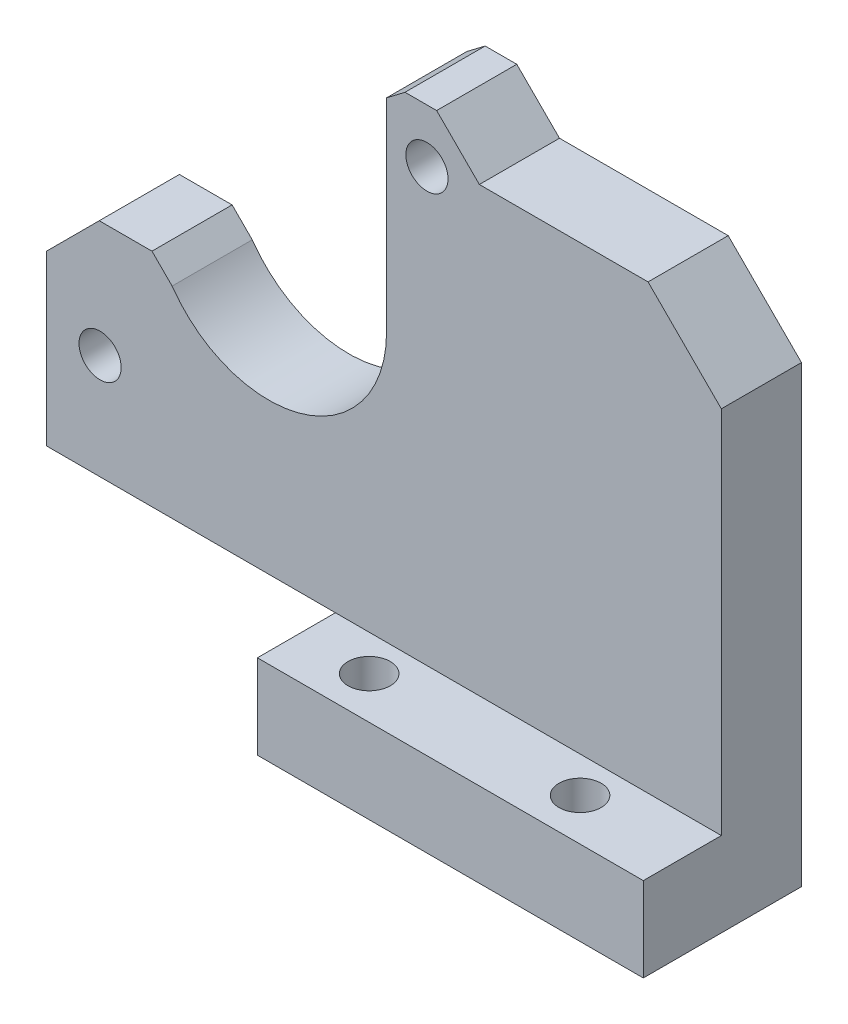
ISO-10303-21;
HEADER;
FILE_DESCRIPTION(('STEP AP214'),'2;1');
FILE_NAME('part.step','',(''),(''),'','','');
FILE_SCHEMA(('AUTOMOTIVE_DESIGN { 1 0 10303 214 1 1 1 1 }'));
ENDSEC;
DATA;
#1=APPLICATION_CONTEXT('core data for automotive mechanical design processes');
#2=APPLICATION_PROTOCOL_DEFINITION('international standard','automotive_design',2000,#1);
#3=PRODUCT_CONTEXT('',#1,'mechanical');
#4=PRODUCT('Part','Part','',(#3));
#5=PRODUCT_RELATED_PRODUCT_CATEGORY('part','',(#4));
#6=PRODUCT_DEFINITION_FORMATION('','',#4);
#7=PRODUCT_DEFINITION_CONTEXT('part definition',#1,'design');
#8=PRODUCT_DEFINITION('design','',#6,#7);
#9=PRODUCT_DEFINITION_SHAPE('','',#8);
#10=(LENGTH_UNIT() NAMED_UNIT(*) SI_UNIT(.MILLI.,.METRE.));
#11=(NAMED_UNIT(*) PLANE_ANGLE_UNIT() SI_UNIT($,.RADIAN.));
#12=(NAMED_UNIT(*) SI_UNIT($,.STERADIAN.) SOLID_ANGLE_UNIT());
#13=UNCERTAINTY_MEASURE_WITH_UNIT(LENGTH_MEASURE(1.E-05),#10,'distance_accuracy_value','');
#14=(GEOMETRIC_REPRESENTATION_CONTEXT(3) GLOBAL_UNCERTAINTY_ASSIGNED_CONTEXT((#13)) GLOBAL_UNIT_ASSIGNED_CONTEXT((#10,
#11,#12)) REPRESENTATION_CONTEXT('',''));
#15=CARTESIAN_POINT('',(0.,0.,0.));
#16=DIRECTION('',(0.,0.,1.));
#17=DIRECTION('',(1.,0.,0.));
#18=AXIS2_PLACEMENT_3D('',#15,#16,#17);
#19=CARTESIAN_POINT('',(21.08,25.4680874876408,7.59999999999993));
#20=DIRECTION('',(0.,0.,-1.));
#21=DIRECTION('',(-1.,0.,0.));
#22=AXIS2_PLACEMENT_3D('',#19,#20,#21);
#23=PLANE('',#22);
#24=CARTESIAN_POINT('',(5.08,9.96808748764078,7.6));
#25=DIRECTION('',(0.,0.,1.));
#26=DIRECTION('',(1.,0.,0.));
#27=AXIS2_PLACEMENT_3D('',#24,#25,#26);
#28=CIRCLE('',#27,2.);
#29=CARTESIAN_POINT('',(7.07999999999999,9.96808748764078,7.6));
#30=VERTEX_POINT('',#29);
#31=EDGE_CURVE('E426',#30,#30,#28,.T.);
#32=ORIENTED_EDGE('',*,*,#31,.F.);
#33=EDGE_LOOP('',(#32));
#34=FACE_BOUND('',#33,.T.);
#35=CARTESIAN_POINT('',(36.08,40.9680874876408,7.59999999999991));
#36=DIRECTION('',(0.,0.,1.));
#37=DIRECTION('',(1.,0.,0.));
#38=AXIS2_PLACEMENT_3D('',#35,#36,#37);
#39=CIRCLE('',#38,2.);
#40=CARTESIAN_POINT('',(38.08,40.9680874876408,7.59999999999992));
#41=VERTEX_POINT('',#40);
#42=EDGE_CURVE('E418',#41,#41,#39,.T.);
#43=ORIENTED_EDGE('',*,*,#42,.F.);
#44=EDGE_LOOP('',(#43));
#45=FACE_BOUND('',#44,.T.);
#46=DIRECTION('',(-1.,0.,0.));
#47=VECTOR('',#46,1.);
#48=CARTESIAN_POINT('',(64.,0.,7.59999999999988));
#49=LINE('',#48,#47);
#50=CARTESIAN_POINT('',(64.,0.,7.59999999999988));
#51=VERTEX_POINT('',#50);
#52=CARTESIAN_POINT('',(27.4,0.,7.59999999999997));
#53=VERTEX_POINT('',#52);
#54=EDGE_CURVE('E56',#51,#53,#49,.T.);
#55=ORIENTED_EDGE('',*,*,#54,.F.);
#56=DIRECTION('',(0.,1.,0.));
#57=VECTOR('',#56,1.);
#58=CARTESIAN_POINT('',(64.,-8.00000000000001,7.59999999999988));
#59=LINE('',#58,#57);
#60=CARTESIAN_POINT('',(64.,35.05,7.59999999999988));
#61=VERTEX_POINT('',#60);
#62=EDGE_CURVE('E123',#51,#61,#59,.T.);
#63=ORIENTED_EDGE('',*,*,#62,.T.);
#64=DIRECTION('',(-0.707106781186547,0.707106781186547,0.));
#65=VECTOR('',#64,1.);
#66=CARTESIAN_POINT('',(57.05,42.,7.59999999999984));
#67=LINE('',#66,#65);
#68=CARTESIAN_POINT('',(57.05,42.,7.59999999999984));
#69=VERTEX_POINT('',#68);
#70=EDGE_CURVE('E281',#61,#69,#67,.T.);
#71=ORIENTED_EDGE('',*,*,#70,.T.);
#72=DIRECTION('',(-1.,0.,0.));
#73=VECTOR('',#72,1.);
#74=CARTESIAN_POINT('',(57.05,42.,7.59999999999984));
#75=LINE('',#74,#73);
#76=CARTESIAN_POINT('',(41.05,42.,7.59999999999991));
#77=VERTEX_POINT('',#76);
#78=EDGE_CURVE('E301',#69,#77,#75,.T.);
#79=ORIENTED_EDGE('',*,*,#78,.T.);
#80=DIRECTION('',(-0.707106781186548,0.707106781186547,0.));
#81=VECTOR('',#80,1.);
#82=CARTESIAN_POINT('',(41.05,42.,7.59999999999991));
#83=LINE('',#82,#81);
#84=CARTESIAN_POINT('',(37.,46.05,7.59999999999991));
#85=VERTEX_POINT('',#84);
#86=EDGE_CURVE('E297',#77,#85,#83,.T.);
#87=ORIENTED_EDGE('',*,*,#86,.T.);
#88=DIRECTION('',(-1.,0.,0.));
#89=VECTOR('',#88,1.);
#90=CARTESIAN_POINT('',(37.,46.05,7.59999999999991));
#91=LINE('',#90,#89);
#92=CARTESIAN_POINT('',(34.,46.05,7.59999999999991));
#93=VERTEX_POINT('',#92);
#94=EDGE_CURVE('E300',#85,#93,#91,.T.);
#95=ORIENTED_EDGE('',*,*,#94,.T.);
#96=DIRECTION('',(-0.79574305950185,-0.605634364327715,0.));
#97=VECTOR('',#96,1.);
#98=CARTESIAN_POINT('',(34.,46.05,7.59999999999991));
#99=LINE('',#98,#97);
#100=CARTESIAN_POINT('',(32.25,44.7180874876408,7.5999999999999));
#101=VERTEX_POINT('',#100);
#102=EDGE_CURVE('E306',#93,#101,#99,.T.);
#103=ORIENTED_EDGE('',*,*,#102,.T.);
#104=DIRECTION('',(0.,-1.,0.));
#105=VECTOR('',#104,1.);
#106=CARTESIAN_POINT('',(32.25,44.7180874876408,7.5999999999999));
#107=LINE('',#106,#105);
#108=CARTESIAN_POINT('',(32.25,25.4680874876408,7.5999999999999));
#109=VERTEX_POINT('',#108);
#110=EDGE_CURVE('E313',#101,#109,#107,.T.);
#111=ORIENTED_EDGE('',*,*,#110,.T.);
#112=CARTESIAN_POINT('',(21.08,25.4680874876408,7.59999999999993));
#113=DIRECTION('',(0.,0.,-1.));
#114=DIRECTION('',(-1.,0.,0.));
#115=AXIS2_PLACEMENT_3D('',#112,#113,#114);
#116=CIRCLE('',#115,11.17);
#117=CARTESIAN_POINT('',(11.91,19.09,7.59999999999997));
#118=VERTEX_POINT('',#117);
#119=EDGE_CURVE('E316',#109,#118,#116,.T.);
#120=ORIENTED_EDGE('',*,*,#119,.T.);
#121=DIRECTION('',(-0.707106781186548,0.707106781186547,0.));
#122=VECTOR('',#121,1.);
#123=CARTESIAN_POINT('',(11.91,19.09,7.59999999999997));
#124=LINE('',#123,#122);
#125=CARTESIAN_POINT('',(10.,21.,7.59999999999998));
#126=VERTEX_POINT('',#125);
#127=EDGE_CURVE('E158',#118,#126,#124,.T.);
#128=ORIENTED_EDGE('',*,*,#127,.T.);
#129=DIRECTION('',(-1.,0.,0.));
#130=VECTOR('',#129,1.);
#131=CARTESIAN_POINT('',(10.,21.,7.59999999999998));
#132=LINE('',#131,#130);
#133=CARTESIAN_POINT('',(5.,21.,7.6));
#134=VERTEX_POINT('',#133);
#135=EDGE_CURVE('E152',#126,#134,#132,.T.);
#136=ORIENTED_EDGE('',*,*,#135,.T.);
#137=DIRECTION('',(-0.707106781186547,-0.707106781186548,0.));
#138=VECTOR('',#137,1.);
#139=CARTESIAN_POINT('',(5.,21.,7.6));
#140=LINE('',#139,#138);
#141=CARTESIAN_POINT('',(0.,16.,7.6));
#142=VERTEX_POINT('',#141);
#143=EDGE_CURVE('E155',#134,#142,#140,.T.);
#144=ORIENTED_EDGE('',*,*,#143,.T.);
#145=DIRECTION('',(0.,-1.,0.));
#146=VECTOR('',#145,1.);
#147=CARTESIAN_POINT('',(0.,0.,7.6));
#148=LINE('',#147,#146);
#149=CARTESIAN_POINT('',(0.,0.,7.6));
#150=VERTEX_POINT('',#149);
#151=EDGE_CURVE('E63',#142,#150,#148,.T.);
#152=ORIENTED_EDGE('',*,*,#151,.T.);
#153=DIRECTION('',(1.,0.,0.));
#154=VECTOR('',#153,1.);
#155=CARTESIAN_POINT('',(0.,0.,7.6));
#156=LINE('',#155,#154);
#157=EDGE_CURVE('E181',#150,#53,#156,.T.);
#158=ORIENTED_EDGE('',*,*,#157,.T.);
#159=EDGE_LOOP('',(#55,#63,#71,#79,#87,#95,#103,#111,#120,#128,#136,#144,#152,#158));
#160=FACE_BOUND('',#159,.T.);
#161=ADVANCED_FACE('F40',(#34,#45,#160),#23,.F.);
#162=CARTESIAN_POINT('',(27.4,-8.00000000000001,7.59999999999997));
#163=DIRECTION('',(0.,1.,0.));
#164=DIRECTION('',(0.,0.,1.));
#165=AXIS2_PLACEMENT_3D('',#162,#163,#164);
#166=PLANE('',#165);
#167=CARTESIAN_POINT('',(54.,-8.00000000000001,10.9999999999998));
#168=DIRECTION('',(0.,1.,0.));
#169=DIRECTION('',(0.,0.,1.));
#170=AXIS2_PLACEMENT_3D('',#167,#168,#169);
#171=CIRCLE('',#170,2.);
#172=CARTESIAN_POINT('',(54.,-8.00000000000001,12.9999999999998));
#173=VERTEX_POINT('',#172);
#174=EDGE_CURVE('E356',#173,#173,#171,.T.);
#175=ORIENTED_EDGE('',*,*,#174,.T.);
#176=EDGE_LOOP('',(#175));
#177=FACE_BOUND('',#176,.T.);
#178=CARTESIAN_POINT('',(34.,-8.00000000000001,10.9999999999999));
#179=DIRECTION('',(0.,1.,0.));
#180=DIRECTION('',(0.,0.,1.));
#181=AXIS2_PLACEMENT_3D('',#178,#179,#180);
#182=CIRCLE('',#181,2.);
#183=CARTESIAN_POINT('',(34.,-8.00000000000001,12.9999999999999));
#184=VERTEX_POINT('',#183);
#185=EDGE_CURVE('E406',#184,#184,#182,.T.);
#186=ORIENTED_EDGE('',*,*,#185,.T.);
#187=EDGE_LOOP('',(#186));
#188=FACE_BOUND('',#187,.T.);
#189=DIRECTION('',(1.,0.,0.));
#190=VECTOR('',#189,1.);
#191=CARTESIAN_POINT('',(27.4,-8.00000000000001,0.));
#192=LINE('',#191,#190);
#193=CARTESIAN_POINT('',(27.4,-8.00000000000001,0.));
#194=VERTEX_POINT('',#193);
#195=CARTESIAN_POINT('',(64.,-8.00000000000001,-1.11022302462516E-13));
#196=VERTEX_POINT('',#195);
#197=EDGE_CURVE('E188',#194,#196,#192,.T.);
#198=ORIENTED_EDGE('',*,*,#197,.T.);
#199=DIRECTION('',(0.,0.,-1.));
#200=VECTOR('',#199,1.);
#201=CARTESIAN_POINT('',(64.,-8.00000000000001,7.59999999999988));
#202=LINE('',#201,#200);
#203=CARTESIAN_POINT('',(64.,-8.00000000000001,14.9999999999998));
#204=VERTEX_POINT('',#203);
#205=EDGE_CURVE('E11',#204,#196,#202,.T.);
#206=ORIENTED_EDGE('',*,*,#205,.F.);
#207=DIRECTION('',(1.,0.,0.));
#208=VECTOR('',#207,1.);
#209=CARTESIAN_POINT('',(64.,-8.00000000000001,14.9999999999998));
#210=LINE('',#209,#208);
#211=CARTESIAN_POINT('',(27.4,-8.00000000000001,14.9999999999998));
#212=VERTEX_POINT('',#211);
#213=EDGE_CURVE('E362',#212,#204,#210,.T.);
#214=ORIENTED_EDGE('',*,*,#213,.F.);
#215=DIRECTION('',(0.,0.,-1.));
#216=VECTOR('',#215,1.);
#217=CARTESIAN_POINT('',(27.4,-8.00000000000001,7.59999999999997));
#218=LINE('',#217,#216);
#219=EDGE_CURVE('E187',#212,#194,#218,.T.);
#220=ORIENTED_EDGE('',*,*,#219,.T.);
#221=EDGE_LOOP('',(#198,#206,#214,#220));
#222=FACE_BOUND('',#221,.T.);
#223=ADVANCED_FACE('F42',(#177,#188,#222),#166,.F.);
#224=CARTESIAN_POINT('',(64.,-8.00000000000001,7.59999999999988));
#225=DIRECTION('',(-1.,0.,0.));
#226=DIRECTION('',(0.,0.,1.));
#227=AXIS2_PLACEMENT_3D('',#224,#225,#226);
#228=PLANE('',#227);
#229=DIRECTION('',(0.,1.,0.));
#230=VECTOR('',#229,1.);
#231=CARTESIAN_POINT('',(64.,-8.00000000000001,-1.11022302462516E-13));
#232=LINE('',#231,#230);
#233=CARTESIAN_POINT('',(64.,35.05,-1.11022302462516E-13));
#234=VERTEX_POINT('',#233);
#235=EDGE_CURVE('E192',#196,#234,#232,.T.);
#236=ORIENTED_EDGE('',*,*,#235,.T.);
#237=DIRECTION('',(0.,0.,-1.));
#238=VECTOR('',#237,1.);
#239=CARTESIAN_POINT('',(64.,35.05,7.59999999999988));
#240=LINE('',#239,#238);
#241=EDGE_CURVE('E49',#61,#234,#240,.T.);
#242=ORIENTED_EDGE('',*,*,#241,.F.);
#243=ORIENTED_EDGE('',*,*,#62,.F.);
#244=DIRECTION('',(0.,0.,-1.));
#245=VECTOR('',#244,1.);
#246=CARTESIAN_POINT('',(64.,0.,14.9999999999998));
#247=LINE('',#246,#245);
#248=CARTESIAN_POINT('',(64.,0.,14.9999999999998));
#249=VERTEX_POINT('',#248);
#250=EDGE_CURVE('E193',#249,#51,#247,.T.);
#251=ORIENTED_EDGE('',*,*,#250,.F.);
#252=DIRECTION('',(0.,1.,0.));
#253=VECTOR('',#252,1.);
#254=CARTESIAN_POINT('',(64.,0.,14.9999999999998));
#255=LINE('',#254,#253);
#256=EDGE_CURVE('E355',#204,#249,#255,.T.);
#257=ORIENTED_EDGE('',*,*,#256,.F.);
#258=ORIENTED_EDGE('',*,*,#205,.T.);
#259=EDGE_LOOP('',(#236,#242,#243,#251,#257,#258));
#260=FACE_BOUND('',#259,.T.);
#261=ADVANCED_FACE('F504',(#260),#228,.F.);
#262=CARTESIAN_POINT('',(57.05,42.,7.59999999999984));
#263=DIRECTION('',(-0.707106781186548,-0.707106781186548,0.));
#264=DIRECTION('',(0.707106781186548,-0.707106781186548,0.));
#265=AXIS2_PLACEMENT_3D('',#262,#263,#264);
#266=PLANE('',#265);
#267=DIRECTION('',(-0.707106781186547,0.707106781186547,0.));
#268=VECTOR('',#267,1.);
#269=CARTESIAN_POINT('',(57.05,42.,-1.66533453693773E-13));
#270=LINE('',#269,#268);
#271=CARTESIAN_POINT('',(57.05,42.,-1.66533453693773E-13));
#272=VERTEX_POINT('',#271);
#273=EDGE_CURVE('E196',#234,#272,#270,.T.);
#274=ORIENTED_EDGE('',*,*,#273,.T.);
#275=DIRECTION('',(0.,0.,-1.));
#276=VECTOR('',#275,1.);
#277=CARTESIAN_POINT('',(57.05,42.,7.59999999999984));
#278=LINE('',#277,#276);
#279=EDGE_CURVE('E270',#69,#272,#278,.T.);
#280=ORIENTED_EDGE('',*,*,#279,.F.);
#281=ORIENTED_EDGE('',*,*,#70,.F.);
#282=ORIENTED_EDGE('',*,*,#241,.T.);
#283=EDGE_LOOP('',(#274,#280,#281,#282));
#284=FACE_BOUND('',#283,.T.);
#285=ADVANCED_FACE('F279',(#284),#266,.F.);
#286=CARTESIAN_POINT('',(57.05,42.,7.59999999999984));
#287=DIRECTION('',(0.,-1.,0.));
#288=DIRECTION('',(0.,0.,-1.));
#289=AXIS2_PLACEMENT_3D('',#286,#287,#288);
#290=PLANE('',#289);
#291=DIRECTION('',(-1.,0.,0.));
#292=VECTOR('',#291,1.);
#293=CARTESIAN_POINT('',(57.05,42.,-1.66533453693773E-13));
#294=LINE('',#293,#292);
#295=CARTESIAN_POINT('',(41.05,42.,0.));
#296=VERTEX_POINT('',#295);
#297=EDGE_CURVE('E199',#272,#296,#294,.T.);
#298=ORIENTED_EDGE('',*,*,#297,.T.);
#299=DIRECTION('',(0.,0.,-1.));
#300=VECTOR('',#299,1.);
#301=CARTESIAN_POINT('',(41.05,42.,7.59999999999991));
#302=LINE('',#301,#300);
#303=EDGE_CURVE('E266',#77,#296,#302,.T.);
#304=ORIENTED_EDGE('',*,*,#303,.F.);
#305=ORIENTED_EDGE('',*,*,#78,.F.);
#306=ORIENTED_EDGE('',*,*,#279,.T.);
#307=EDGE_LOOP('',(#298,#304,#305,#306));
#308=FACE_BOUND('',#307,.T.);
#309=ADVANCED_FACE('F291',(#308),#290,.F.);
#310=CARTESIAN_POINT('',(41.05,42.,7.59999999999991));
#311=DIRECTION('',(-0.707106781186547,-0.707106781186548,0.));
#312=DIRECTION('',(0.707106781186548,-0.707106781186547,0.));
#313=AXIS2_PLACEMENT_3D('',#310,#311,#312);
#314=PLANE('',#313);
#315=DIRECTION('',(-0.707106781186548,0.707106781186547,0.));
#316=VECTOR('',#315,1.);
#317=CARTESIAN_POINT('',(41.05,42.,0.));
#318=LINE('',#317,#316);
#319=CARTESIAN_POINT('',(37.,46.05,0.));
#320=VERTEX_POINT('',#319);
#321=EDGE_CURVE('E202',#296,#320,#318,.T.);
#322=ORIENTED_EDGE('',*,*,#321,.T.);
#323=DIRECTION('',(0.,0.,-1.));
#324=VECTOR('',#323,1.);
#325=CARTESIAN_POINT('',(37.,46.05,7.59999999999991));
#326=LINE('',#325,#324);
#327=EDGE_CURVE('E262',#85,#320,#326,.T.);
#328=ORIENTED_EDGE('',*,*,#327,.F.);
#329=ORIENTED_EDGE('',*,*,#86,.F.);
#330=ORIENTED_EDGE('',*,*,#303,.T.);
#331=EDGE_LOOP('',(#322,#328,#329,#330));
#332=FACE_BOUND('',#331,.T.);
#333=ADVANCED_FACE('F295',(#332),#314,.F.);
#334=CARTESIAN_POINT('',(37.,46.05,7.59999999999991));
#335=DIRECTION('',(0.,-1.,0.));
#336=DIRECTION('',(0.,0.,-1.));
#337=AXIS2_PLACEMENT_3D('',#334,#335,#336);
#338=PLANE('',#337);
#339=DIRECTION('',(-1.,0.,0.));
#340=VECTOR('',#339,1.);
#341=CARTESIAN_POINT('',(37.,46.05,0.));
#342=LINE('',#341,#340);
#343=CARTESIAN_POINT('',(34.,46.05,0.));
#344=VERTEX_POINT('',#343);
#345=EDGE_CURVE('E205',#320,#344,#342,.T.);
#346=ORIENTED_EDGE('',*,*,#345,.T.);
#347=DIRECTION('',(0.,0.,-1.));
#348=VECTOR('',#347,1.);
#349=CARTESIAN_POINT('',(34.,46.05,7.59999999999991));
#350=LINE('',#349,#348);
#351=EDGE_CURVE('E258',#93,#344,#350,.T.);
#352=ORIENTED_EDGE('',*,*,#351,.F.);
#353=ORIENTED_EDGE('',*,*,#94,.F.);
#354=ORIENTED_EDGE('',*,*,#327,.T.);
#355=EDGE_LOOP('',(#346,#352,#353,#354));
#356=FACE_BOUND('',#355,.T.);
#357=ADVANCED_FACE('F494',(#356),#338,.F.);
#358=CARTESIAN_POINT('',(34.,46.05,7.59999999999991));
#359=DIRECTION('',(0.605634364327715,-0.79574305950185,0.));
#360=DIRECTION('',(0.79574305950185,0.605634364327715,0.));
#361=AXIS2_PLACEMENT_3D('',#358,#359,#360);
#362=PLANE('',#361);
#363=DIRECTION('',(-0.79574305950185,-0.605634364327715,0.));
#364=VECTOR('',#363,1.);
#365=CARTESIAN_POINT('',(34.,46.05,0.));
#366=LINE('',#365,#364);
#367=CARTESIAN_POINT('',(32.25,44.7180874876408,-1.11022302462516E-13));
#368=VERTEX_POINT('',#367);
#369=EDGE_CURVE('E208',#344,#368,#366,.T.);
#370=ORIENTED_EDGE('',*,*,#369,.T.);
#371=DIRECTION('',(0.,0.,-1.));
#372=VECTOR('',#371,1.);
#373=CARTESIAN_POINT('',(32.25,44.7180874876408,7.5999999999999));
#374=LINE('',#373,#372);
#375=EDGE_CURVE('E254',#101,#368,#374,.T.);
#376=ORIENTED_EDGE('',*,*,#375,.F.);
#377=ORIENTED_EDGE('',*,*,#102,.F.);
#378=ORIENTED_EDGE('',*,*,#351,.T.);
#379=EDGE_LOOP('',(#370,#376,#377,#378));
#380=FACE_BOUND('',#379,.T.);
#381=ADVANCED_FACE('F490',(#380),#362,.F.);
#382=CARTESIAN_POINT('',(32.25,44.7180874876408,7.5999999999999));
#383=DIRECTION('',(1.,0.,0.));
#384=DIRECTION('',(0.,1.,0.));
#385=AXIS2_PLACEMENT_3D('',#382,#383,#384);
#386=PLANE('',#385);
#387=DIRECTION('',(0.,-1.,0.));
#388=VECTOR('',#387,1.);
#389=CARTESIAN_POINT('',(32.25,44.7180874876408,-1.11022302462516E-13));
#390=LINE('',#389,#388);
#391=CARTESIAN_POINT('',(32.25,25.4680874876408,-1.11022302462516E-13));
#392=VERTEX_POINT('',#391);
#393=EDGE_CURVE('E211',#368,#392,#390,.T.);
#394=ORIENTED_EDGE('',*,*,#393,.T.);
#395=DIRECTION('',(0.,0.,-1.));
#396=VECTOR('',#395,1.);
#397=CARTESIAN_POINT('',(32.25,25.4680874876408,7.5999999999999));
#398=LINE('',#397,#396);
#399=EDGE_CURVE('E250',#109,#392,#398,.T.);
#400=ORIENTED_EDGE('',*,*,#399,.F.);
#401=ORIENTED_EDGE('',*,*,#110,.F.);
#402=ORIENTED_EDGE('',*,*,#375,.T.);
#403=EDGE_LOOP('',(#394,#400,#401,#402));
#404=FACE_BOUND('',#403,.T.);
#405=ADVANCED_FACE('F487',(#404),#386,.F.);
#406=CARTESIAN_POINT('',(21.08,25.4680874876408,7.59999999999993));
#407=DIRECTION('',(0.,0.,-1.));
#408=DIRECTION('',(-1.,0.,0.));
#409=AXIS2_PLACEMENT_3D('',#406,#407,#408);
#410=CYLINDRICAL_SURFACE('',#409,11.17);
#411=CARTESIAN_POINT('',(21.08,25.4680874876408,0.));
#412=DIRECTION('',(0.,0.,-1.));
#413=DIRECTION('',(-1.,0.,0.));
#414=AXIS2_PLACEMENT_3D('',#411,#412,#413);
#415=CIRCLE('',#414,11.17);
#416=CARTESIAN_POINT('',(11.91,19.09,0.));
#417=VERTEX_POINT('',#416);
#418=EDGE_CURVE('E214',#392,#417,#415,.T.);
#419=ORIENTED_EDGE('',*,*,#418,.T.);
#420=DIRECTION('',(0.,0.,-1.));
#421=VECTOR('',#420,1.);
#422=CARTESIAN_POINT('',(11.91,19.09,7.59999999999997));
#423=LINE('',#422,#421);
#424=EDGE_CURVE('E246',#118,#417,#423,.T.);
#425=ORIENTED_EDGE('',*,*,#424,.F.);
#426=ORIENTED_EDGE('',*,*,#119,.F.);
#427=ORIENTED_EDGE('',*,*,#399,.T.);
#428=EDGE_LOOP('',(#419,#425,#426,#427));
#429=FACE_BOUND('',#428,.T.);
#430=ADVANCED_FACE('F330',(#429),#410,.F.);
#431=CARTESIAN_POINT('',(11.91,19.09,7.59999999999997));
#432=DIRECTION('',(-0.707106781186547,-0.707106781186548,0.));
#433=DIRECTION('',(0.707106781186548,-0.707106781186547,0.));
#434=AXIS2_PLACEMENT_3D('',#431,#432,#433);
#435=PLANE('',#434);
#436=DIRECTION('',(-0.707106781186548,0.707106781186547,0.));
#437=VECTOR('',#436,1.);
#438=CARTESIAN_POINT('',(11.91,19.09,0.));
#439=LINE('',#438,#437);
#440=CARTESIAN_POINT('',(9.99999999999999,21.,0.));
#441=VERTEX_POINT('',#440);
#442=EDGE_CURVE('E217',#417,#441,#439,.T.);
#443=ORIENTED_EDGE('',*,*,#442,.T.);
#444=DIRECTION('',(0.,0.,-1.));
#445=VECTOR('',#444,1.);
#446=CARTESIAN_POINT('',(10.,21.,7.59999999999998));
#447=LINE('',#446,#445);
#448=EDGE_CURVE('E172',#126,#441,#447,.T.);
#449=ORIENTED_EDGE('',*,*,#448,.F.);
#450=ORIENTED_EDGE('',*,*,#127,.F.);
#451=ORIENTED_EDGE('',*,*,#424,.T.);
#452=EDGE_LOOP('',(#443,#449,#450,#451));
#453=FACE_BOUND('',#452,.T.);
#454=ADVANCED_FACE('F334',(#453),#435,.F.);
#455=CARTESIAN_POINT('',(10.,21.,7.59999999999998));
#456=DIRECTION('',(0.,-1.,0.));
#457=DIRECTION('',(0.,0.,-1.));
#458=AXIS2_PLACEMENT_3D('',#455,#456,#457);
#459=PLANE('',#458);
#460=DIRECTION('',(-1.,0.,0.));
#461=VECTOR('',#460,1.);
#462=CARTESIAN_POINT('',(9.99999999999999,21.,0.));
#463=LINE('',#462,#461);
#464=CARTESIAN_POINT('',(5.,21.,0.));
#465=VERTEX_POINT('',#464);
#466=EDGE_CURVE('E168',#441,#465,#463,.T.);
#467=ORIENTED_EDGE('',*,*,#466,.T.);
#468=DIRECTION('',(0.,0.,-1.));
#469=VECTOR('',#468,1.);
#470=CARTESIAN_POINT('',(5.,21.,7.6));
#471=LINE('',#470,#469);
#472=EDGE_CURVE('E165',#134,#465,#471,.T.);
#473=ORIENTED_EDGE('',*,*,#472,.F.);
#474=ORIENTED_EDGE('',*,*,#135,.F.);
#475=ORIENTED_EDGE('',*,*,#448,.T.);
#476=EDGE_LOOP('',(#467,#473,#474,#475));
#477=FACE_BOUND('',#476,.T.);
#478=ADVANCED_FACE('F166',(#477),#459,.F.);
#479=CARTESIAN_POINT('',(5.,21.,7.6));
#480=DIRECTION('',(0.707106781186548,-0.707106781186547,0.));
#481=DIRECTION('',(0.707106781186547,0.707106781186548,0.));
#482=AXIS2_PLACEMENT_3D('',#479,#480,#481);
#483=PLANE('',#482);
#484=DIRECTION('',(-0.707106781186547,-0.707106781186548,0.));
#485=VECTOR('',#484,1.);
#486=CARTESIAN_POINT('',(5.,21.,0.));
#487=LINE('',#486,#485);
#488=CARTESIAN_POINT('',(0.,16.,0.));
#489=VERTEX_POINT('',#488);
#490=EDGE_CURVE('E222',#465,#489,#487,.T.);
#491=ORIENTED_EDGE('',*,*,#490,.T.);
#492=DIRECTION('',(0.,0.,-1.));
#493=VECTOR('',#492,1.);
#494=CARTESIAN_POINT('',(0.,16.,7.6));
#495=LINE('',#494,#493);
#496=EDGE_CURVE('E173',#142,#489,#495,.T.);
#497=ORIENTED_EDGE('',*,*,#496,.F.);
#498=ORIENTED_EDGE('',*,*,#143,.F.);
#499=ORIENTED_EDGE('',*,*,#472,.T.);
#500=EDGE_LOOP('',(#491,#497,#498,#499));
#501=FACE_BOUND('',#500,.T.);
#502=ADVANCED_FACE('F175',(#501),#483,.F.);
#503=CARTESIAN_POINT('',(0.,0.,7.6));
#504=DIRECTION('',(1.,0.,0.));
#505=DIRECTION('',(0.,0.,-1.));
#506=AXIS2_PLACEMENT_3D('',#503,#504,#505);
#507=PLANE('',#506);
#508=DIRECTION('',(0.,-1.,0.));
#509=VECTOR('',#508,1.);
#510=CARTESIAN_POINT('',(0.,0.,0.));
#511=LINE('',#510,#509);
#512=CARTESIAN_POINT('',(0.,0.,0.));
#513=VERTEX_POINT('',#512);
#514=EDGE_CURVE('E225',#489,#513,#511,.T.);
#515=ORIENTED_EDGE('',*,*,#514,.T.);
#516=DIRECTION('',(0.,0.,-1.));
#517=VECTOR('',#516,1.);
#518=CARTESIAN_POINT('',(0.,0.,7.6));
#519=LINE('',#518,#517);
#520=EDGE_CURVE('E238',#150,#513,#519,.T.);
#521=ORIENTED_EDGE('',*,*,#520,.F.);
#522=ORIENTED_EDGE('',*,*,#151,.F.);
#523=ORIENTED_EDGE('',*,*,#496,.T.);
#524=EDGE_LOOP('',(#515,#521,#522,#523));
#525=FACE_BOUND('',#524,.T.);
#526=ADVANCED_FACE('F338',(#525),#507,.F.);
#527=CARTESIAN_POINT('',(0.,0.,7.6));
#528=DIRECTION('',(0.,1.,0.));
#529=DIRECTION('',(0.,0.,1.));
#530=AXIS2_PLACEMENT_3D('',#527,#528,#529);
#531=PLANE('',#530);
#532=DIRECTION('',(1.,0.,0.));
#533=VECTOR('',#532,1.);
#534=CARTESIAN_POINT('',(0.,0.,0.));
#535=LINE('',#534,#533);
#536=CARTESIAN_POINT('',(27.4,0.,0.));
#537=VERTEX_POINT('',#536);
#538=EDGE_CURVE('E228',#513,#537,#535,.T.);
#539=ORIENTED_EDGE('',*,*,#538,.T.);
#540=DIRECTION('',(0.,0.,-1.));
#541=VECTOR('',#540,1.);
#542=CARTESIAN_POINT('',(27.4,0.,7.59999999999997));
#543=LINE('',#542,#541);
#544=EDGE_CURVE('E235',#53,#537,#543,.T.);
#545=ORIENTED_EDGE('',*,*,#544,.F.);
#546=ORIENTED_EDGE('',*,*,#157,.F.);
#547=ORIENTED_EDGE('',*,*,#520,.T.);
#548=EDGE_LOOP('',(#539,#545,#546,#547));
#549=FACE_BOUND('',#548,.T.);
#550=ADVANCED_FACE('F342',(#549),#531,.F.);
#551=CARTESIAN_POINT('',(27.4,0.,7.59999999999997));
#552=DIRECTION('',(1.,0.,0.));
#553=DIRECTION('',(0.,0.,-1.));
#554=AXIS2_PLACEMENT_3D('',#551,#552,#553);
#555=PLANE('',#554);
#556=DIRECTION('',(0.,-1.,0.));
#557=VECTOR('',#556,1.);
#558=CARTESIAN_POINT('',(27.4,0.,0.));
#559=LINE('',#558,#557);
#560=EDGE_CURVE('E118',#537,#194,#559,.T.);
#561=ORIENTED_EDGE('',*,*,#560,.T.);
#562=ORIENTED_EDGE('',*,*,#219,.F.);
#563=DIRECTION('',(0.,-1.,0.));
#564=VECTOR('',#563,1.);
#565=CARTESIAN_POINT('',(27.4,0.,14.9999999999998));
#566=LINE('',#565,#564);
#567=CARTESIAN_POINT('',(27.4,0.,14.9999999999998));
#568=VERTEX_POINT('',#567);
#569=EDGE_CURVE('E360',#568,#212,#566,.T.);
#570=ORIENTED_EDGE('',*,*,#569,.F.);
#571=DIRECTION('',(0.,0.,-1.));
#572=VECTOR('',#571,1.);
#573=CARTESIAN_POINT('',(27.4,0.,14.9999999999998));
#574=LINE('',#573,#572);
#575=EDGE_CURVE('E351',#568,#53,#574,.T.);
#576=ORIENTED_EDGE('',*,*,#575,.T.);
#577=ORIENTED_EDGE('',*,*,#544,.T.);
#578=EDGE_LOOP('',(#561,#562,#570,#576,#577));
#579=FACE_BOUND('',#578,.T.);
#580=ADVANCED_FACE('F358',(#579),#555,.F.);
#581=CARTESIAN_POINT('',(21.08,25.4680874876408,0.));
#582=DIRECTION('',(0.,0.,-1.));
#583=DIRECTION('',(-1.,0.,0.));
#584=AXIS2_PLACEMENT_3D('',#581,#582,#583);
#585=PLANE('',#584);
#586=CARTESIAN_POINT('',(5.08,9.96808748764078,0.));
#587=DIRECTION('',(0.,0.,1.));
#588=DIRECTION('',(1.,0.,0.));
#589=AXIS2_PLACEMENT_3D('',#586,#587,#588);
#590=CIRCLE('',#589,2.);
#591=CARTESIAN_POINT('',(7.08,9.96808748764078,0.));
#592=VERTEX_POINT('',#591);
#593=EDGE_CURVE('E407',#592,#592,#590,.T.);
#594=ORIENTED_EDGE('',*,*,#593,.T.);
#595=EDGE_LOOP('',(#594));
#596=FACE_BOUND('',#595,.T.);
#597=CARTESIAN_POINT('',(36.08,40.9680874876408,0.));
#598=DIRECTION('',(0.,0.,1.));
#599=DIRECTION('',(1.,0.,0.));
#600=AXIS2_PLACEMENT_3D('',#597,#598,#599);
#601=CIRCLE('',#600,2.);
#602=CARTESIAN_POINT('',(38.08,40.9680874876408,0.));
#603=VERTEX_POINT('',#602);
#604=EDGE_CURVE('E422',#603,#603,#601,.T.);
#605=ORIENTED_EDGE('',*,*,#604,.T.);
#606=EDGE_LOOP('',(#605));
#607=FACE_BOUND('',#606,.T.);
#608=ORIENTED_EDGE('',*,*,#197,.F.);
#609=ORIENTED_EDGE('',*,*,#560,.F.);
#610=ORIENTED_EDGE('',*,*,#538,.F.);
#611=ORIENTED_EDGE('',*,*,#514,.F.);
#612=ORIENTED_EDGE('',*,*,#490,.F.);
#613=ORIENTED_EDGE('',*,*,#466,.F.);
#614=ORIENTED_EDGE('',*,*,#442,.F.);
#615=ORIENTED_EDGE('',*,*,#418,.F.);
#616=ORIENTED_EDGE('',*,*,#393,.F.);
#617=ORIENTED_EDGE('',*,*,#369,.F.);
#618=ORIENTED_EDGE('',*,*,#345,.F.);
#619=ORIENTED_EDGE('',*,*,#321,.F.);
#620=ORIENTED_EDGE('',*,*,#297,.F.);
#621=ORIENTED_EDGE('',*,*,#273,.F.);
#622=ORIENTED_EDGE('',*,*,#235,.F.);
#623=EDGE_LOOP('',(#608,#609,#610,#611,#612,#613,#614,#615,#616,#617,#618,#619,#620,#621,#622));
#624=FACE_BOUND('',#623,.T.);
#625=ADVANCED_FACE('F286',(#596,#607,#624),#585,.T.);
#626=CARTESIAN_POINT('',(64.,0.,14.9999999999998));
#627=DIRECTION('',(0.,-1.,0.));
#628=DIRECTION('',(0.,0.,-1.));
#629=AXIS2_PLACEMENT_3D('',#626,#627,#628);
#630=PLANE('',#629);
#631=CARTESIAN_POINT('',(54.,0.,10.9999999999998));
#632=DIRECTION('',(0.,1.,0.));
#633=DIRECTION('',(0.,0.,1.));
#634=AXIS2_PLACEMENT_3D('',#631,#632,#633);
#635=CIRCLE('',#634,2.);
#636=CARTESIAN_POINT('',(54.,0.,12.9999999999998));
#637=VERTEX_POINT('',#636);
#638=EDGE_CURVE('E411',#637,#637,#635,.T.);
#639=ORIENTED_EDGE('',*,*,#638,.F.);
#640=EDGE_LOOP('',(#639));
#641=FACE_BOUND('',#640,.T.);
#642=CARTESIAN_POINT('',(34.,0.,10.9999999999999));
#643=DIRECTION('',(0.,1.,0.));
#644=DIRECTION('',(0.,0.,1.));
#645=AXIS2_PLACEMENT_3D('',#642,#643,#644);
#646=CIRCLE('',#645,2.);
#647=CARTESIAN_POINT('',(34.,0.,12.9999999999999));
#648=VERTEX_POINT('',#647);
#649=EDGE_CURVE('E402',#648,#648,#646,.T.);
#650=ORIENTED_EDGE('',*,*,#649,.F.);
#651=EDGE_LOOP('',(#650));
#652=FACE_BOUND('',#651,.T.);
#653=ORIENTED_EDGE('',*,*,#54,.T.);
#654=ORIENTED_EDGE('',*,*,#575,.F.);
#655=DIRECTION('',(-1.,0.,0.));
#656=VECTOR('',#655,1.);
#657=CARTESIAN_POINT('',(64.,0.,14.9999999999998));
#658=LINE('',#657,#656);
#659=EDGE_CURVE('E395',#249,#568,#658,.T.);
#660=ORIENTED_EDGE('',*,*,#659,.F.);
#661=ORIENTED_EDGE('',*,*,#250,.T.);
#662=EDGE_LOOP('',(#653,#654,#660,#661));
#663=FACE_BOUND('',#662,.T.);
#664=ADVANCED_FACE('F348',(#641,#652,#663),#630,.F.);
#665=CARTESIAN_POINT('',(0.,0.,15.));
#666=DIRECTION('',(0.,0.,-1.));
#667=DIRECTION('',(-1.,0.,0.));
#668=AXIS2_PLACEMENT_3D('',#665,#666,#667);
#669=PLANE('',#668);
#670=ORIENTED_EDGE('',*,*,#256,.T.);
#671=ORIENTED_EDGE('',*,*,#659,.T.);
#672=ORIENTED_EDGE('',*,*,#569,.T.);
#673=ORIENTED_EDGE('',*,*,#213,.T.);
#674=EDGE_LOOP('',(#670,#671,#672,#673));
#675=FACE_BOUND('',#674,.T.);
#676=ADVANCED_FACE('F463',(#675),#669,.F.);
#677=CARTESIAN_POINT('',(34.,-8.00000000000001,10.9999999999999));
#678=DIRECTION('',(0.,1.,0.));
#679=DIRECTION('',(0.,0.,1.));
#680=AXIS2_PLACEMENT_3D('',#677,#678,#679);
#681=CYLINDRICAL_SURFACE('',#680,2.);
#682=ORIENTED_EDGE('',*,*,#185,.F.);
#683=EDGE_LOOP('',(#682));
#684=FACE_BOUND('',#683,.T.);
#685=ORIENTED_EDGE('',*,*,#649,.T.);
#686=EDGE_LOOP('',(#685));
#687=FACE_BOUND('',#686,.T.);
#688=ADVANCED_FACE('F456',(#684,#687),#681,.F.);
#689=CARTESIAN_POINT('',(54.,-8.00000000000001,10.9999999999998));
#690=DIRECTION('',(0.,1.,0.));
#691=DIRECTION('',(0.,0.,1.));
#692=AXIS2_PLACEMENT_3D('',#689,#690,#691);
#693=CYLINDRICAL_SURFACE('',#692,2.);
#694=ORIENTED_EDGE('',*,*,#174,.F.);
#695=EDGE_LOOP('',(#694));
#696=FACE_BOUND('',#695,.T.);
#697=ORIENTED_EDGE('',*,*,#638,.T.);
#698=EDGE_LOOP('',(#697));
#699=FACE_BOUND('',#698,.T.);
#700=ADVANCED_FACE('F450',(#696,#699),#693,.F.);
#701=CARTESIAN_POINT('',(36.08,40.9680874876408,0.));
#702=DIRECTION('',(0.,0.,1.));
#703=DIRECTION('',(1.,0.,0.));
#704=AXIS2_PLACEMENT_3D('',#701,#702,#703);
#705=CYLINDRICAL_SURFACE('',#704,2.);
#706=CARTESIAN_POINT('',(38.08,40.9680874876408,0.));
#707=CARTESIAN_POINT('',(38.08,40.9680874876408,0.0791666666665873));
#708=CARTESIAN_POINT('',(38.08,40.9680874876408,0.158333333333254));
#709=CARTESIAN_POINT('',(38.08,40.9680874876408,0.316666666666587));
#710=CARTESIAN_POINT('',(38.08,40.9680874876408,0.395833333333254));
#711=CARTESIAN_POINT('',(38.08,40.9680874876408,0.554166666666587));
#712=CARTESIAN_POINT('',(38.08,40.9680874876408,0.633333333333254));
#713=CARTESIAN_POINT('',(38.08,40.9680874876408,0.791666666666587));
#714=CARTESIAN_POINT('',(38.08,40.9680874876408,0.870833333333254));
#715=CARTESIAN_POINT('',(38.08,40.9680874876408,1.02916666666659));
#716=CARTESIAN_POINT('',(38.08,40.9680874876408,1.10833333333325));
#717=CARTESIAN_POINT('',(38.08,40.9680874876408,1.26666666666659));
#718=CARTESIAN_POINT('',(38.08,40.9680874876408,1.34583333333325));
#719=CARTESIAN_POINT('',(38.08,40.9680874876408,1.50416666666659));
#720=CARTESIAN_POINT('',(38.08,40.9680874876408,1.58333333333325));
#721=CARTESIAN_POINT('',(38.08,40.9680874876408,1.74166666666659));
#722=CARTESIAN_POINT('',(38.08,40.9680874876408,1.82083333333325));
#723=CARTESIAN_POINT('',(38.08,40.9680874876408,1.97916666666659));
#724=CARTESIAN_POINT('',(38.08,40.9680874876408,2.05833333333325));
#725=CARTESIAN_POINT('',(38.08,40.9680874876408,2.21666666666659));
#726=CARTESIAN_POINT('',(38.08,40.9680874876408,2.29583333333325));
#727=CARTESIAN_POINT('',(38.08,40.9680874876408,2.45416666666659));
#728=CARTESIAN_POINT('',(38.08,40.9680874876408,2.53333333333325));
#729=CARTESIAN_POINT('',(38.08,40.9680874876408,2.69166666666659));
#730=CARTESIAN_POINT('',(38.08,40.9680874876408,2.77083333333325));
#731=CARTESIAN_POINT('',(38.08,40.9680874876408,2.92916666666659));
#732=CARTESIAN_POINT('',(38.08,40.9680874876408,3.00833333333325));
#733=CARTESIAN_POINT('',(38.08,40.9680874876408,3.16666666666659));
#734=CARTESIAN_POINT('',(38.08,40.9680874876408,3.24583333333325));
#735=CARTESIAN_POINT('',(38.08,40.9680874876408,3.40416666666659));
#736=CARTESIAN_POINT('',(38.08,40.9680874876408,3.48333333333325));
#737=CARTESIAN_POINT('',(38.08,40.9680874876408,3.64166666666659));
#738=CARTESIAN_POINT('',(38.08,40.9680874876408,3.72083333333325));
#739=CARTESIAN_POINT('',(38.08,40.9680874876408,3.87916666666659));
#740=CARTESIAN_POINT('',(38.08,40.9680874876408,3.95833333333325));
#741=CARTESIAN_POINT('',(38.08,40.9680874876408,4.11666666666658));
#742=CARTESIAN_POINT('',(38.08,40.9680874876408,4.19583333333325));
#743=CARTESIAN_POINT('',(38.08,40.9680874876408,4.35416666666658));
#744=CARTESIAN_POINT('',(38.08,40.9680874876408,4.43333333333325));
#745=CARTESIAN_POINT('',(38.08,40.9680874876408,4.59166666666658));
#746=CARTESIAN_POINT('',(38.08,40.9680874876408,4.67083333333325));
#747=CARTESIAN_POINT('',(38.08,40.9680874876408,4.82916666666658));
#748=CARTESIAN_POINT('',(38.08,40.9680874876408,4.90833333333325));
#749=CARTESIAN_POINT('',(38.08,40.9680874876408,5.06666666666658));
#750=CARTESIAN_POINT('',(38.08,40.9680874876408,5.14583333333325));
#751=CARTESIAN_POINT('',(38.08,40.9680874876408,5.30416666666658));
#752=CARTESIAN_POINT('',(38.08,40.9680874876408,5.38333333333325));
#753=CARTESIAN_POINT('',(38.08,40.9680874876408,5.54166666666658));
#754=CARTESIAN_POINT('',(38.08,40.9680874876408,5.62083333333325));
#755=CARTESIAN_POINT('',(38.08,40.9680874876408,5.77916666666658));
#756=CARTESIAN_POINT('',(38.08,40.9680874876408,5.85833333333325));
#757=CARTESIAN_POINT('',(38.08,40.9680874876408,6.01666666666658));
#758=CARTESIAN_POINT('',(38.08,40.9680874876408,6.09583333333325));
#759=CARTESIAN_POINT('',(38.08,40.9680874876408,6.25416666666658));
#760=CARTESIAN_POINT('',(38.08,40.9680874876408,6.33333333333325));
#761=CARTESIAN_POINT('',(38.08,40.9680874876408,6.49166666666658));
#762=CARTESIAN_POINT('',(38.08,40.9680874876408,6.57083333333325));
#763=CARTESIAN_POINT('',(38.08,40.9680874876408,6.72916666666658));
#764=CARTESIAN_POINT('',(38.08,40.9680874876408,6.80833333333325));
#765=CARTESIAN_POINT('',(38.08,40.9680874876408,6.96666666666658));
#766=CARTESIAN_POINT('',(38.08,40.9680874876408,7.04583333333325));
#767=CARTESIAN_POINT('',(38.08,40.9680874876408,7.20416666666658));
#768=CARTESIAN_POINT('',(38.08,40.9680874876408,7.28333333333325));
#769=CARTESIAN_POINT('',(38.08,40.9680874876408,7.44166666666658));
#770=CARTESIAN_POINT('',(38.08,40.9680874876408,7.52083333333325));
#771=CARTESIAN_POINT('',(38.08,40.9680874876408,7.59999999999992));
#772=B_SPLINE_CURVE_WITH_KNOTS('',3,(#706,#707,#708,#709,#710,#711,#712,#713,#714,#715,#716,
#717,#718,#719,#720,#721,#722,#723,#724,#725,#726,#727,#728,#729,#730,#731,#732,#733,#734,#735,
#736,#737,#738,#739,#740,#741,#742,#743,#744,#745,#746,#747,#748,#749,#750,#751,#752,#753,#754,
#755,#756,#757,#758,#759,#760,#761,#762,#763,#764,#765,#766,#767,#768,#769,#770,#771),
.UNSPECIFIED.,.F.,.F.,(4,2,2,2,2,2,2,2,2,2,2,2,2,2,2,2,2,2,2,2,2,2,2,2,2,2,2,2,2,2,2,2,4),(0.,
0.2375,0.475,0.7125,0.95,1.1875,1.425,1.6625,1.9,2.1375,2.375,2.6125,2.85,3.0875,3.325,3.5625,
3.8,4.0375,4.275,4.5125,4.75,4.9875,5.225,5.4625,5.7,5.9375,6.175,6.4125,6.65,6.8875,7.125,
7.3625,7.6),.UNSPECIFIED.);
#773=EDGE_CURVE('BSEAM440',#603,#41,#772,.T.);
#774=ORIENTED_EDGE('',*,*,#604,.F.);
#775=ORIENTED_EDGE('',*,*,#42,.T.);
#776=ORIENTED_EDGE('',*,*,#773,.T.);
#777=ORIENTED_EDGE('',*,*,#773,.F.);
#778=EDGE_LOOP('',(#774,#776,#775,#777));
#779=FACE_BOUND('',#778,.T.);
#780=ADVANCED_FACE('F440',(#779),#705,.F.);
#781=CARTESIAN_POINT('',(5.08,9.96808748764078,0.));
#782=DIRECTION('',(0.,0.,1.));
#783=DIRECTION('',(1.,0.,0.));
#784=AXIS2_PLACEMENT_3D('',#781,#782,#783);
#785=CYLINDRICAL_SURFACE('',#784,2.);
#786=CARTESIAN_POINT('',(7.08,9.96808748764078,0.));
#787=CARTESIAN_POINT('',(7.08,9.96808748764078,0.0791666666666705));
#788=CARTESIAN_POINT('',(7.08,9.96808748764078,0.158333333333337));
#789=CARTESIAN_POINT('',(7.08,9.96808748764078,0.31666666666667));
#790=CARTESIAN_POINT('',(7.08,9.96808748764078,0.395833333333337));
#791=CARTESIAN_POINT('',(7.08,9.96808748764078,0.55416666666667));
#792=CARTESIAN_POINT('',(7.08,9.96808748764078,0.633333333333337));
#793=CARTESIAN_POINT('',(7.08,9.96808748764078,0.79166666666667));
#794=CARTESIAN_POINT('',(7.08,9.96808748764078,0.870833333333337));
#795=CARTESIAN_POINT('',(7.08,9.96808748764078,1.02916666666667));
#796=CARTESIAN_POINT('',(7.08,9.96808748764078,1.10833333333334));
#797=CARTESIAN_POINT('',(7.08,9.96808748764078,1.26666666666667));
#798=CARTESIAN_POINT('',(7.08,9.96808748764078,1.34583333333334));
#799=CARTESIAN_POINT('',(7.08,9.96808748764078,1.50416666666667));
#800=CARTESIAN_POINT('',(7.08,9.96808748764078,1.58333333333334));
#801=CARTESIAN_POINT('',(7.08,9.96808748764078,1.74166666666667));
#802=CARTESIAN_POINT('',(7.08,9.96808748764078,1.82083333333334));
#803=CARTESIAN_POINT('',(7.08,9.96808748764078,1.97916666666667));
#804=CARTESIAN_POINT('',(7.08,9.96808748764078,2.05833333333334));
#805=CARTESIAN_POINT('',(7.08,9.96808748764078,2.21666666666667));
#806=CARTESIAN_POINT('',(7.08,9.96808748764078,2.29583333333334));
#807=CARTESIAN_POINT('',(7.08,9.96808748764078,2.45416666666667));
#808=CARTESIAN_POINT('',(7.08,9.96808748764078,2.53333333333334));
#809=CARTESIAN_POINT('',(7.08,9.96808748764078,2.69166666666667));
#810=CARTESIAN_POINT('',(7.07999999999999,9.96808748764078,2.77083333333334));
#811=CARTESIAN_POINT('',(7.07999999999999,9.96808748764078,2.92916666666667));
#812=CARTESIAN_POINT('',(7.07999999999999,9.96808748764078,3.00833333333334));
#813=CARTESIAN_POINT('',(7.07999999999999,9.96808748764078,3.16666666666667));
#814=CARTESIAN_POINT('',(7.07999999999999,9.96808748764078,3.24583333333334));
#815=CARTESIAN_POINT('',(7.07999999999999,9.96808748764078,3.40416666666667));
#816=CARTESIAN_POINT('',(7.07999999999999,9.96808748764078,3.48333333333334));
#817=CARTESIAN_POINT('',(7.07999999999999,9.96808748764078,3.64166666666667));
#818=CARTESIAN_POINT('',(7.07999999999999,9.96808748764078,3.72083333333333));
#819=CARTESIAN_POINT('',(7.07999999999999,9.96808748764078,3.87916666666667));
#820=CARTESIAN_POINT('',(7.07999999999999,9.96808748764078,3.95833333333333));
#821=CARTESIAN_POINT('',(7.07999999999999,9.96808748764078,4.11666666666667));
#822=CARTESIAN_POINT('',(7.07999999999999,9.96808748764078,4.19583333333333));
#823=CARTESIAN_POINT('',(7.07999999999999,9.96808748764078,4.35416666666667));
#824=CARTESIAN_POINT('',(7.07999999999999,9.96808748764078,4.43333333333333));
#825=CARTESIAN_POINT('',(7.07999999999999,9.96808748764078,4.59166666666667));
#826=CARTESIAN_POINT('',(7.07999999999999,9.96808748764078,4.67083333333333));
#827=CARTESIAN_POINT('',(7.07999999999999,9.96808748764078,4.82916666666667));
#828=CARTESIAN_POINT('',(7.07999999999999,9.96808748764078,4.90833333333333));
#829=CARTESIAN_POINT('',(7.07999999999999,9.96808748764078,5.06666666666667));
#830=CARTESIAN_POINT('',(7.07999999999999,9.96808748764078,5.14583333333333));
#831=CARTESIAN_POINT('',(7.07999999999999,9.96808748764078,5.30416666666667));
#832=CARTESIAN_POINT('',(7.07999999999999,9.96808748764078,5.38333333333333));
#833=CARTESIAN_POINT('',(7.07999999999999,9.96808748764078,5.54166666666667));
#834=CARTESIAN_POINT('',(7.07999999999999,9.96808748764078,5.62083333333333));
#835=CARTESIAN_POINT('',(7.07999999999999,9.96808748764078,5.77916666666667));
#836=CARTESIAN_POINT('',(7.07999999999999,9.96808748764078,5.85833333333333));
#837=CARTESIAN_POINT('',(7.07999999999999,9.96808748764078,6.01666666666667));
#838=CARTESIAN_POINT('',(7.07999999999999,9.96808748764078,6.09583333333333));
#839=CARTESIAN_POINT('',(7.07999999999999,9.96808748764078,6.25416666666667));
#840=CARTESIAN_POINT('',(7.07999999999999,9.96808748764078,6.33333333333333));
#841=CARTESIAN_POINT('',(7.07999999999999,9.96808748764078,6.49166666666667));
#842=CARTESIAN_POINT('',(7.07999999999999,9.96808748764078,6.57083333333333));
#843=CARTESIAN_POINT('',(7.07999999999999,9.96808748764078,6.72916666666667));
#844=CARTESIAN_POINT('',(7.07999999999999,9.96808748764078,6.80833333333333));
#845=CARTESIAN_POINT('',(7.07999999999999,9.96808748764078,6.96666666666667));
#846=CARTESIAN_POINT('',(7.07999999999999,9.96808748764078,7.04583333333333));
#847=CARTESIAN_POINT('',(7.07999999999999,9.96808748764078,7.20416666666667));
#848=CARTESIAN_POINT('',(7.07999999999999,9.96808748764078,7.28333333333333));
#849=CARTESIAN_POINT('',(7.07999999999999,9.96808748764078,7.44166666666667));
#850=CARTESIAN_POINT('',(7.07999999999999,9.96808748764078,7.52083333333333));
#851=CARTESIAN_POINT('',(7.07999999999999,9.96808748764078,7.6));
#852=B_SPLINE_CURVE_WITH_KNOTS('',3,(#786,#787,#788,#789,#790,#791,#792,#793,#794,#795,#796,
#797,#798,#799,#800,#801,#802,#803,#804,#805,#806,#807,#808,#809,#810,#811,#812,#813,#814,#815,
#816,#817,#818,#819,#820,#821,#822,#823,#824,#825,#826,#827,#828,#829,#830,#831,#832,#833,#834,
#835,#836,#837,#838,#839,#840,#841,#842,#843,#844,#845,#846,#847,#848,#849,#850,#851),
.UNSPECIFIED.,.F.,.F.,(4,2,2,2,2,2,2,2,2,2,2,2,2,2,2,2,2,2,2,2,2,2,2,2,2,2,2,2,2,2,2,2,4),(0.,
0.2375,0.475,0.7125,0.95,1.1875,1.425,1.6625,1.9,2.1375,2.375,2.6125,2.85,3.0875,3.325,3.5625,
3.8,4.0375,4.275,4.5125,4.75,4.9875,5.225,5.4625,5.7,5.9375,6.175,6.4125,6.65,6.8875,7.125,
7.3625,7.6),.UNSPECIFIED.);
#853=EDGE_CURVE('BSEAM437',#592,#30,#852,.T.);
#854=ORIENTED_EDGE('',*,*,#593,.F.);
#855=ORIENTED_EDGE('',*,*,#31,.T.);
#856=ORIENTED_EDGE('',*,*,#853,.T.);
#857=ORIENTED_EDGE('',*,*,#853,.F.);
#858=EDGE_LOOP('',(#854,#856,#855,#857));
#859=FACE_BOUND('',#858,.T.);
#860=ADVANCED_FACE('F437',(#859),#785,.F.);
#861=CLOSED_SHELL('',(#161,#223,#261,#285,#309,#333,#357,#381,#405,#430,#454,#478,#502,#526,
#550,#580,#625,#664,#676,#688,#700,#780,#860));
#862=MANIFOLD_SOLID_BREP('B2',#861);
#863=ADVANCED_BREP_SHAPE_REPRESENTATION('',(#18,#862),#14);
#864=SHAPE_DEFINITION_REPRESENTATION(#9,#863);
ENDSEC;
END-ISO-10303-21;
